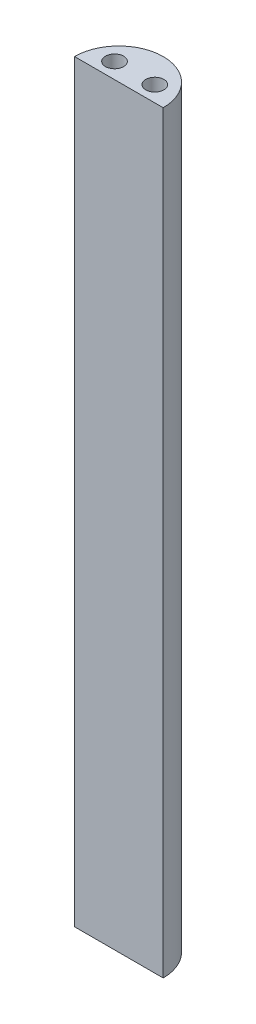
ISO-10303-21;
HEADER;
FILE_DESCRIPTION(('STEP AP214'),'2;1');
FILE_NAME('part.step','',(''),(''),'','','');
FILE_SCHEMA(('AUTOMOTIVE_DESIGN { 1 0 10303 214 1 1 1 1 }'));
ENDSEC;
DATA;
#1=APPLICATION_CONTEXT('core data for automotive mechanical design processes');
#2=APPLICATION_PROTOCOL_DEFINITION('international standard','automotive_design',2000,#1);
#3=PRODUCT_CONTEXT('',#1,'mechanical');
#4=PRODUCT('Part','Part','',(#3));
#5=PRODUCT_RELATED_PRODUCT_CATEGORY('part','',(#4));
#6=PRODUCT_DEFINITION_FORMATION('','',#4);
#7=PRODUCT_DEFINITION_CONTEXT('part definition',#1,'design');
#8=PRODUCT_DEFINITION('design','',#6,#7);
#9=PRODUCT_DEFINITION_SHAPE('','',#8);
#10=(LENGTH_UNIT() NAMED_UNIT(*) SI_UNIT(.MILLI.,.METRE.));
#11=(NAMED_UNIT(*) PLANE_ANGLE_UNIT() SI_UNIT($,.RADIAN.));
#12=(NAMED_UNIT(*) SI_UNIT($,.STERADIAN.) SOLID_ANGLE_UNIT());
#13=UNCERTAINTY_MEASURE_WITH_UNIT(LENGTH_MEASURE(1.E-05),#10,'distance_accuracy_value','');
#14=(GEOMETRIC_REPRESENTATION_CONTEXT(3) GLOBAL_UNCERTAINTY_ASSIGNED_CONTEXT((#13)) GLOBAL_UNIT_ASSIGNED_CONTEXT((#10,
#11,#12)) REPRESENTATION_CONTEXT('',''));
#15=CARTESIAN_POINT('',(0.,0.,0.));
#16=DIRECTION('',(0.,0.,1.));
#17=DIRECTION('',(1.,0.,0.));
#18=AXIS2_PLACEMENT_3D('',#15,#16,#17);
#19=CARTESIAN_POINT('',(0.,431.8,0.));
#20=DIRECTION('',(0.,-1.,0.));
#21=DIRECTION('',(0.,0.,-1.));
#22=AXIS2_PLACEMENT_3D('',#19,#20,#21);
#23=CYLINDRICAL_SURFACE('',#22,25.4);
#24=CARTESIAN_POINT('',(0.,0.,0.));
#25=DIRECTION('',(0.,1.,0.));
#26=DIRECTION('',(0.,0.,1.));
#27=AXIS2_PLACEMENT_3D('',#24,#25,#26);
#28=CIRCLE('',#27,25.4);
#29=CARTESIAN_POINT('',(25.4,0.,0.));
#30=VERTEX_POINT('',#29);
#31=CARTESIAN_POINT('',(-25.4,0.,0.));
#32=VERTEX_POINT('',#31);
#33=EDGE_CURVE('E78',#30,#32,#28,.T.);
#34=ORIENTED_EDGE('',*,*,#33,.T.);
#35=DIRECTION('',(0.,-1.,0.));
#36=VECTOR('',#35,1.);
#37=CARTESIAN_POINT('',(-25.4,431.8,0.));
#38=LINE('',#37,#36);
#39=CARTESIAN_POINT('',(-25.4,431.8,0.));
#40=VERTEX_POINT('',#39);
#41=EDGE_CURVE('E11',#40,#32,#38,.T.);
#42=ORIENTED_EDGE('',*,*,#41,.F.);
#43=CARTESIAN_POINT('',(0.,431.8,0.));
#44=DIRECTION('',(0.,1.,0.));
#45=DIRECTION('',(0.,0.,1.));
#46=AXIS2_PLACEMENT_3D('',#43,#44,#45);
#47=CIRCLE('',#46,25.4);
#48=CARTESIAN_POINT('',(25.4,431.8,0.));
#49=VERTEX_POINT('',#48);
#50=EDGE_CURVE('E77',#49,#40,#47,.T.);
#51=ORIENTED_EDGE('',*,*,#50,.F.);
#52=DIRECTION('',(0.,-1.,0.));
#53=VECTOR('',#52,1.);
#54=CARTESIAN_POINT('',(25.4,431.8,0.));
#55=LINE('',#54,#53);
#56=EDGE_CURVE('E54',#49,#30,#55,.T.);
#57=ORIENTED_EDGE('',*,*,#56,.T.);
#58=EDGE_LOOP('',(#34,#42,#51,#57));
#59=FACE_BOUND('',#58,.T.);
#60=ADVANCED_FACE('F45',(#59),#23,.T.);
#61=CARTESIAN_POINT('',(-25.4,431.8,0.));
#62=DIRECTION('',(0.,0.,-1.));
#63=DIRECTION('',(-1.,0.,0.));
#64=AXIS2_PLACEMENT_3D('',#61,#62,#63);
#65=PLANE('',#64);
#66=DIRECTION('',(1.,0.,0.));
#67=VECTOR('',#66,1.);
#68=CARTESIAN_POINT('',(-25.4,0.,0.));
#69=LINE('',#68,#67);
#70=EDGE_CURVE('E69',#32,#30,#69,.T.);
#71=ORIENTED_EDGE('',*,*,#70,.T.);
#72=ORIENTED_EDGE('',*,*,#56,.F.);
#73=DIRECTION('',(1.,0.,0.));
#74=VECTOR('',#73,1.);
#75=CARTESIAN_POINT('',(-25.4,431.8,0.));
#76=LINE('',#75,#74);
#77=EDGE_CURVE('E61',#40,#49,#76,.T.);
#78=ORIENTED_EDGE('',*,*,#77,.F.);
#79=ORIENTED_EDGE('',*,*,#41,.T.);
#80=EDGE_LOOP('',(#71,#72,#78,#79));
#81=FACE_BOUND('',#80,.T.);
#82=ADVANCED_FACE('F72',(#81),#65,.F.);
#83=CARTESIAN_POINT('',(0.,431.8,0.));
#84=DIRECTION('',(0.,1.,0.));
#85=DIRECTION('',(0.,0.,1.));
#86=AXIS2_PLACEMENT_3D('',#83,#84,#85);
#87=PLANE('',#86);
#88=CARTESIAN_POINT('',(-11.54495024,431.8,-9.057446198));
#89=DIRECTION('',(0.,1.,0.));
#90=DIRECTION('',(0.,0.,1.));
#91=AXIS2_PLACEMENT_3D('',#88,#89,#90);
#92=CIRCLE('',#91,5.207);
#93=CARTESIAN_POINT('',(-11.54495024,431.8,-3.850446198));
#94=VERTEX_POINT('',#93);
#95=EDGE_CURVE('E88',#94,#94,#92,.T.);
#96=ORIENTED_EDGE('',*,*,#95,.F.);
#97=EDGE_LOOP('',(#96));
#98=FACE_BOUND('',#97,.T.);
#99=CARTESIAN_POINT('',(11.54495024,431.8,-9.057446198));
#100=DIRECTION('',(0.,1.,0.));
#101=DIRECTION('',(0.,0.,1.));
#102=AXIS2_PLACEMENT_3D('',#99,#100,#101);
#103=CIRCLE('',#102,5.207);
#104=CARTESIAN_POINT('',(11.54495024,431.8,-3.850446198));
#105=VERTEX_POINT('',#104);
#106=EDGE_CURVE('E99',#105,#105,#103,.T.);
#107=ORIENTED_EDGE('',*,*,#106,.F.);
#108=EDGE_LOOP('',(#107));
#109=FACE_BOUND('',#108,.T.);
#110=ORIENTED_EDGE('',*,*,#50,.T.);
#111=ORIENTED_EDGE('',*,*,#77,.T.);
#112=EDGE_LOOP('',(#110,#111));
#113=FACE_BOUND('',#112,.T.);
#114=ADVANCED_FACE('F109',(#98,#109,#113),#87,.T.);
#115=CARTESIAN_POINT('',(0.,0.,0.));
#116=DIRECTION('',(0.,1.,0.));
#117=DIRECTION('',(0.,0.,1.));
#118=AXIS2_PLACEMENT_3D('',#115,#116,#117);
#119=PLANE('',#118);
#120=ORIENTED_EDGE('',*,*,#33,.F.);
#121=ORIENTED_EDGE('',*,*,#70,.F.);
#122=EDGE_LOOP('',(#120,#121));
#123=FACE_BOUND('',#122,.T.);
#124=ADVANCED_FACE('F82',(#123),#119,.F.);
#125=CARTESIAN_POINT('',(11.54495024,406.4,-9.057446198));
#126=DIRECTION('',(0.,1.,0.));
#127=DIRECTION('',(0.,0.,1.));
#128=AXIS2_PLACEMENT_3D('',#125,#126,#127);
#129=CYLINDRICAL_SURFACE('',#128,5.207);
#130=CARTESIAN_POINT('',(11.54495024,406.4,-9.057446198));
#131=DIRECTION('',(0.,1.,0.));
#132=DIRECTION('',(0.,0.,1.));
#133=AXIS2_PLACEMENT_3D('',#130,#131,#132);
#134=CIRCLE('',#133,5.207);
#135=CARTESIAN_POINT('',(11.54495024,406.4,-3.850446198));
#136=VERTEX_POINT('',#135);
#137=EDGE_CURVE('E95',#136,#136,#134,.T.);
#138=ORIENTED_EDGE('',*,*,#137,.F.);
#139=EDGE_LOOP('',(#138));
#140=FACE_BOUND('',#139,.T.);
#141=ORIENTED_EDGE('',*,*,#106,.T.);
#142=EDGE_LOOP('',(#141));
#143=FACE_BOUND('',#142,.T.);
#144=ADVANCED_FACE('F115',(#140,#143),#129,.F.);
#145=CARTESIAN_POINT('',(11.54495024,406.4,-9.057446198));
#146=DIRECTION('',(0.,1.,0.));
#147=DIRECTION('',(0.,0.,1.));
#148=AXIS2_PLACEMENT_3D('',#145,#146,#147);
#149=PLANE('',#148);
#150=ORIENTED_EDGE('',*,*,#137,.T.);
#151=EDGE_LOOP('',(#150));
#152=FACE_BOUND('',#151,.T.);
#153=ADVANCED_FACE('F117',(#152),#149,.T.);
#154=CARTESIAN_POINT('',(-11.54495024,406.4,-9.057446198));
#155=DIRECTION('',(0.,1.,0.));
#156=DIRECTION('',(0.,0.,1.));
#157=AXIS2_PLACEMENT_3D('',#154,#155,#156);
#158=CYLINDRICAL_SURFACE('',#157,5.207);
#159=CARTESIAN_POINT('',(-11.54495024,406.4,-9.057446198));
#160=DIRECTION('',(0.,1.,0.));
#161=DIRECTION('',(0.,0.,1.));
#162=AXIS2_PLACEMENT_3D('',#159,#160,#161);
#163=CIRCLE('',#162,5.207);
#164=CARTESIAN_POINT('',(-11.54495024,406.4,-3.850446198));
#165=VERTEX_POINT('',#164);
#166=EDGE_CURVE('E84',#165,#165,#163,.T.);
#167=ORIENTED_EDGE('',*,*,#166,.F.);
#168=EDGE_LOOP('',(#167));
#169=FACE_BOUND('',#168,.T.);
#170=ORIENTED_EDGE('',*,*,#95,.T.);
#171=EDGE_LOOP('',(#170));
#172=FACE_BOUND('',#171,.T.);
#173=ADVANCED_FACE('F107',(#169,#172),#158,.F.);
#174=CARTESIAN_POINT('',(-11.54495024,406.4,-9.057446198));
#175=DIRECTION('',(0.,1.,0.));
#176=DIRECTION('',(0.,0.,1.));
#177=AXIS2_PLACEMENT_3D('',#174,#175,#176);
#178=PLANE('',#177);
#179=ORIENTED_EDGE('',*,*,#166,.T.);
#180=EDGE_LOOP('',(#179));
#181=FACE_BOUND('',#180,.T.);
#182=ADVANCED_FACE('F166',(#181),#178,.T.);
#183=CLOSED_SHELL('',(#60,#82,#114,#124,#144,#153,#173,#182));
#184=MANIFOLD_SOLID_BREP('B2',#183);
#185=ADVANCED_BREP_SHAPE_REPRESENTATION('',(#18,#184),#14);
#186=SHAPE_DEFINITION_REPRESENTATION(#9,#185);
ENDSEC;
END-ISO-10303-21;
